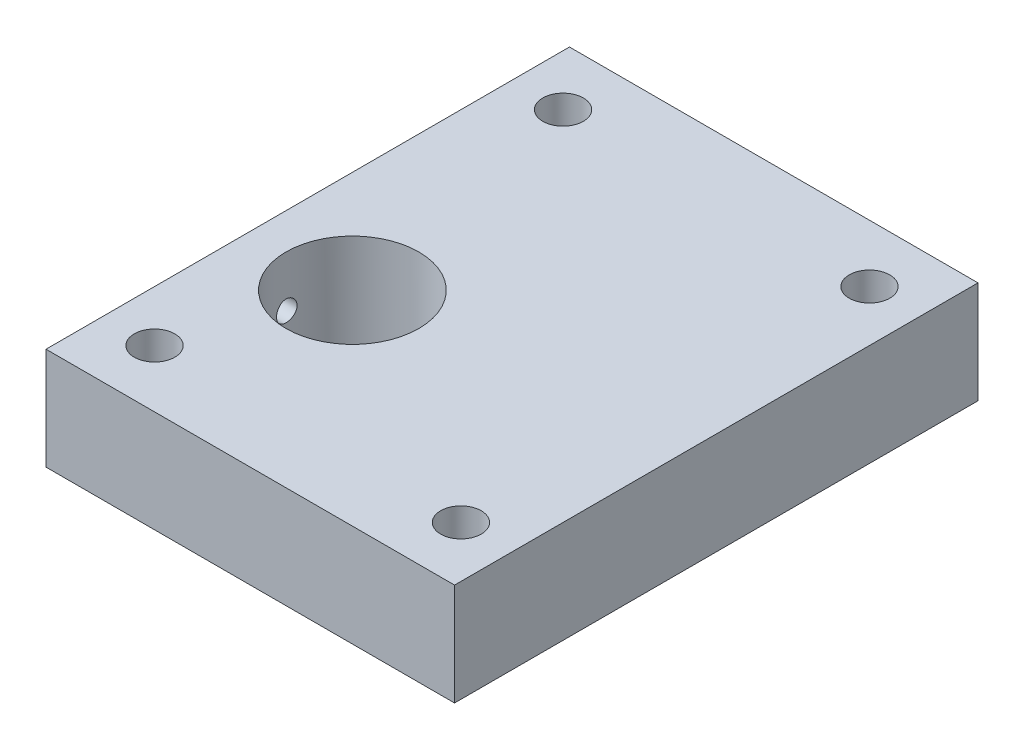
ISO-10303-21;
HEADER;
FILE_DESCRIPTION(('STEP AP214'),'2;1');
FILE_NAME('part.step','',(''),(''),'','','');
FILE_SCHEMA(('AUTOMOTIVE_DESIGN { 1 0 10303 214 1 1 1 1 }'));
ENDSEC;
DATA;
#1=APPLICATION_CONTEXT('core data for automotive mechanical design processes');
#2=APPLICATION_PROTOCOL_DEFINITION('international standard','automotive_design',2000,#1);
#3=PRODUCT_CONTEXT('',#1,'mechanical');
#4=PRODUCT('Part','Part','',(#3));
#5=PRODUCT_RELATED_PRODUCT_CATEGORY('part','',(#4));
#6=PRODUCT_DEFINITION_FORMATION('','',#4);
#7=PRODUCT_DEFINITION_CONTEXT('part definition',#1,'design');
#8=PRODUCT_DEFINITION('design','',#6,#7);
#9=PRODUCT_DEFINITION_SHAPE('','',#8);
#10=(LENGTH_UNIT() NAMED_UNIT(*) SI_UNIT(.MILLI.,.METRE.));
#11=(NAMED_UNIT(*) PLANE_ANGLE_UNIT() SI_UNIT($,.RADIAN.));
#12=(NAMED_UNIT(*) SI_UNIT($,.STERADIAN.) SOLID_ANGLE_UNIT());
#13=UNCERTAINTY_MEASURE_WITH_UNIT(LENGTH_MEASURE(1.E-05),#10,'distance_accuracy_value','');
#14=(GEOMETRIC_REPRESENTATION_CONTEXT(3) GLOBAL_UNCERTAINTY_ASSIGNED_CONTEXT((#13)) GLOBAL_UNIT_ASSIGNED_CONTEXT((#10,
#11,#12)) REPRESENTATION_CONTEXT('',''));
#15=CARTESIAN_POINT('',(0.,0.,0.));
#16=DIRECTION('',(0.,0.,1.));
#17=DIRECTION('',(1.,0.,0.));
#18=AXIS2_PLACEMENT_3D('',#15,#16,#17);
#19=CARTESIAN_POINT('',(50.8,12.7,65.0875));
#20=DIRECTION('',(-1.,0.,0.));
#21=DIRECTION('',(0.,0.,1.));
#22=AXIS2_PLACEMENT_3D('',#19,#20,#21);
#23=PLANE('',#22);
#24=DIRECTION('',(0.,0.,-1.));
#25=VECTOR('',#24,1.);
#26=CARTESIAN_POINT('',(50.8,-12.7,65.0875));
#27=LINE('',#26,#25);
#28=CARTESIAN_POINT('',(50.8,-12.7,65.0875));
#29=VERTEX_POINT('',#28);
#30=CARTESIAN_POINT('',(50.8,-12.7,-65.0875));
#31=VERTEX_POINT('',#30);
#32=EDGE_CURVE('E109',#29,#31,#27,.T.);
#33=ORIENTED_EDGE('',*,*,#32,.T.);
#34=DIRECTION('',(0.,-1.,0.));
#35=VECTOR('',#34,1.);
#36=CARTESIAN_POINT('',(50.8,12.7,-65.0875));
#37=LINE('',#36,#35);
#38=CARTESIAN_POINT('',(50.8,12.7,-65.0875));
#39=VERTEX_POINT('',#38);
#40=EDGE_CURVE('E11',#39,#31,#37,.T.);
#41=ORIENTED_EDGE('',*,*,#40,.F.);
#42=DIRECTION('',(0.,0.,-1.));
#43=VECTOR('',#42,1.);
#44=CARTESIAN_POINT('',(50.8,12.7,65.0875));
#45=LINE('',#44,#43);
#46=CARTESIAN_POINT('',(50.8,12.7,65.0875));
#47=VERTEX_POINT('',#46);
#48=EDGE_CURVE('E96',#47,#39,#45,.T.);
#49=ORIENTED_EDGE('',*,*,#48,.F.);
#50=DIRECTION('',(0.,-1.,0.));
#51=VECTOR('',#50,1.);
#52=CARTESIAN_POINT('',(50.8,12.7,65.0875));
#53=LINE('',#52,#51);
#54=EDGE_CURVE('E105',#47,#29,#53,.T.);
#55=ORIENTED_EDGE('',*,*,#54,.T.);
#56=EDGE_LOOP('',(#33,#41,#49,#55));
#57=FACE_BOUND('',#56,.T.);
#58=ADVANCED_FACE('F39',(#57),#23,.F.);
#59=CARTESIAN_POINT('',(-50.8,12.7,-65.0875));
#60=DIRECTION('',(0.,0.,1.));
#61=DIRECTION('',(1.,0.,0.));
#62=AXIS2_PLACEMENT_3D('',#59,#60,#61);
#63=PLANE('',#62);
#64=DIRECTION('',(-1.,0.,0.));
#65=VECTOR('',#64,1.);
#66=CARTESIAN_POINT('',(-50.8,-12.7,-65.0875));
#67=LINE('',#66,#65);
#68=CARTESIAN_POINT('',(-50.8,-12.7,-65.0875));
#69=VERTEX_POINT('',#68);
#70=EDGE_CURVE('E100',#31,#69,#67,.T.);
#71=ORIENTED_EDGE('',*,*,#70,.T.);
#72=DIRECTION('',(0.,-1.,0.));
#73=VECTOR('',#72,1.);
#74=CARTESIAN_POINT('',(-50.8,12.7,-65.0875));
#75=LINE('',#74,#73);
#76=CARTESIAN_POINT('',(-50.8,12.7,-65.0875));
#77=VERTEX_POINT('',#76);
#78=EDGE_CURVE('E53',#77,#69,#75,.T.);
#79=ORIENTED_EDGE('',*,*,#78,.F.);
#80=DIRECTION('',(-1.,0.,0.));
#81=VECTOR('',#80,1.);
#82=CARTESIAN_POINT('',(-50.8,12.7,-65.0875));
#83=LINE('',#82,#81);
#84=EDGE_CURVE('E91',#39,#77,#83,.T.);
#85=ORIENTED_EDGE('',*,*,#84,.F.);
#86=ORIENTED_EDGE('',*,*,#40,.T.);
#87=EDGE_LOOP('',(#71,#79,#85,#86));
#88=FACE_BOUND('',#87,.T.);
#89=ADVANCED_FACE('F99',(#88),#63,.F.);
#90=CARTESIAN_POINT('',(-50.8,12.7,65.0875));
#91=DIRECTION('',(1.,0.,0.));
#92=DIRECTION('',(0.,0.,-1.));
#93=AXIS2_PLACEMENT_3D('',#90,#91,#92);
#94=PLANE('',#93);
#95=CARTESIAN_POINT('',(-50.8,0.,14.2875));
#96=DIRECTION('',(-1.,0.,0.));
#97=DIRECTION('',(0.,0.,1.));
#98=AXIS2_PLACEMENT_3D('',#95,#96,#97);
#99=CIRCLE('',#98,2.5527);
#100=CARTESIAN_POINT('',(-50.8,0.,16.8402));
#101=VERTEX_POINT('',#100);
#102=EDGE_CURVE('E152',#101,#101,#99,.T.);
#103=ORIENTED_EDGE('',*,*,#102,.F.);
#104=EDGE_LOOP('',(#103));
#105=FACE_BOUND('',#104,.T.);
#106=DIRECTION('',(0.,0.,1.));
#107=VECTOR('',#106,1.);
#108=CARTESIAN_POINT('',(-50.8,-12.7,65.0875));
#109=LINE('',#108,#107);
#110=CARTESIAN_POINT('',(-50.8,-12.7,65.0875));
#111=VERTEX_POINT('',#110);
#112=EDGE_CURVE('E78',#69,#111,#109,.T.);
#113=ORIENTED_EDGE('',*,*,#112,.T.);
#114=DIRECTION('',(0.,-1.,0.));
#115=VECTOR('',#114,1.);
#116=CARTESIAN_POINT('',(-50.8,12.7,65.0875));
#117=LINE('',#116,#115);
#118=CARTESIAN_POINT('',(-50.8,12.7,65.0875));
#119=VERTEX_POINT('',#118);
#120=EDGE_CURVE('E101',#119,#111,#117,.T.);
#121=ORIENTED_EDGE('',*,*,#120,.F.);
#122=DIRECTION('',(0.,0.,1.));
#123=VECTOR('',#122,1.);
#124=CARTESIAN_POINT('',(-50.8,12.7,65.0875));
#125=LINE('',#124,#123);
#126=EDGE_CURVE('E94',#77,#119,#125,.T.);
#127=ORIENTED_EDGE('',*,*,#126,.F.);
#128=ORIENTED_EDGE('',*,*,#78,.T.);
#129=EDGE_LOOP('',(#113,#121,#127,#128));
#130=FACE_BOUND('',#129,.T.);
#131=ADVANCED_FACE('F103',(#105,#130),#94,.F.);
#132=CARTESIAN_POINT('',(-50.8,12.7,65.0875));
#133=DIRECTION('',(0.,0.,-1.));
#134=DIRECTION('',(-1.,0.,0.));
#135=AXIS2_PLACEMENT_3D('',#132,#133,#134);
#136=PLANE('',#135);
#137=DIRECTION('',(1.,0.,0.));
#138=VECTOR('',#137,1.);
#139=CARTESIAN_POINT('',(-50.8,-12.7,65.0875));
#140=LINE('',#139,#138);
#141=EDGE_CURVE('E84',#111,#29,#140,.T.);
#142=ORIENTED_EDGE('',*,*,#141,.T.);
#143=ORIENTED_EDGE('',*,*,#54,.F.);
#144=DIRECTION('',(1.,0.,0.));
#145=VECTOR('',#144,1.);
#146=CARTESIAN_POINT('',(-50.8,12.7,65.0875));
#147=LINE('',#146,#145);
#148=EDGE_CURVE('E61',#119,#47,#147,.T.);
#149=ORIENTED_EDGE('',*,*,#148,.F.);
#150=ORIENTED_EDGE('',*,*,#120,.T.);
#151=EDGE_LOOP('',(#142,#143,#149,#150));
#152=FACE_BOUND('',#151,.T.);
#153=ADVANCED_FACE('F117',(#152),#136,.F.);
#154=CARTESIAN_POINT('',(0.,12.7,0.));
#155=DIRECTION('',(0.,-1.,0.));
#156=DIRECTION('',(0.,0.,-1.));
#157=AXIS2_PLACEMENT_3D('',#154,#155,#156);
#158=PLANE('',#157);
#159=CARTESIAN_POINT('',(38.1,12.7,-50.8000000000001));
#160=DIRECTION('',(0.,-1.,0.));
#161=DIRECTION('',(0.,0.,-1.));
#162=AXIS2_PLACEMENT_3D('',#159,#160,#161);
#163=CIRCLE('',#162,5.04189999999999);
#164=CARTESIAN_POINT('',(38.1,12.7,-55.8419000000001));
#165=VERTEX_POINT('',#164);
#166=EDGE_CURVE('E146',#165,#165,#163,.T.);
#167=ORIENTED_EDGE('',*,*,#166,.T.);
#168=EDGE_LOOP('',(#167));
#169=FACE_BOUND('',#168,.T.);
#170=CARTESIAN_POINT('',(-38.1000000000001,12.7,-50.8000000000001));
#171=DIRECTION('',(0.,-1.,0.));
#172=DIRECTION('',(0.,0.,-1.));
#173=AXIS2_PLACEMENT_3D('',#170,#171,#172);
#174=CIRCLE('',#173,5.04189999999999);
#175=CARTESIAN_POINT('',(-38.1000000000001,12.7,-55.8419000000001));
#176=VERTEX_POINT('',#175);
#177=EDGE_CURVE('E140',#176,#176,#174,.T.);
#178=ORIENTED_EDGE('',*,*,#177,.T.);
#179=EDGE_LOOP('',(#178));
#180=FACE_BOUND('',#179,.T.);
#181=CARTESIAN_POINT('',(-38.1,12.7,50.7999999999999));
#182=DIRECTION('',(0.,-1.,0.));
#183=DIRECTION('',(0.,0.,-1.));
#184=AXIS2_PLACEMENT_3D('',#181,#182,#183);
#185=CIRCLE('',#184,5.04189999999999);
#186=CARTESIAN_POINT('',(-38.1,12.7,45.7580999999999));
#187=VERTEX_POINT('',#186);
#188=EDGE_CURVE('E134',#187,#187,#185,.T.);
#189=ORIENTED_EDGE('',*,*,#188,.T.);
#190=EDGE_LOOP('',(#189));
#191=FACE_BOUND('',#190,.T.);
#192=CARTESIAN_POINT('',(38.0999999999999,12.7,50.7999999999999));
#193=DIRECTION('',(0.,-1.,0.));
#194=DIRECTION('',(0.,0.,-1.));
#195=AXIS2_PLACEMENT_3D('',#192,#193,#194);
#196=CIRCLE('',#195,5.04189999999999);
#197=CARTESIAN_POINT('',(38.0999999999999,12.7,45.7580999999999));
#198=VERTEX_POINT('',#197);
#199=EDGE_CURVE('E128',#198,#198,#196,.T.);
#200=ORIENTED_EDGE('',*,*,#199,.T.);
#201=EDGE_LOOP('',(#200));
#202=FACE_BOUND('',#201,.T.);
#203=CARTESIAN_POINT('',(-25.4,12.7,14.2875));
#204=DIRECTION('',(0.,-1.,0.));
#205=DIRECTION('',(0.,0.,-1.));
#206=AXIS2_PLACEMENT_3D('',#203,#204,#205);
#207=CIRCLE('',#206,16.51);
#208=CARTESIAN_POINT('',(-25.4,12.7,-2.22250000000001));
#209=VERTEX_POINT('',#208);
#210=EDGE_CURVE('E112',#209,#209,#207,.T.);
#211=ORIENTED_EDGE('',*,*,#210,.T.);
#212=EDGE_LOOP('',(#211));
#213=FACE_BOUND('',#212,.T.);
#214=ORIENTED_EDGE('',*,*,#48,.T.);
#215=ORIENTED_EDGE('',*,*,#84,.T.);
#216=ORIENTED_EDGE('',*,*,#126,.T.);
#217=ORIENTED_EDGE('',*,*,#148,.T.);
#218=EDGE_LOOP('',(#214,#215,#216,#217));
#219=FACE_BOUND('',#218,.T.);
#220=ADVANCED_FACE('F92',(#169,#180,#191,#202,#213,#219),#158,.F.);
#221=CARTESIAN_POINT('',(0.,-12.7,0.));
#222=DIRECTION('',(0.,-1.,0.));
#223=DIRECTION('',(0.,0.,-1.));
#224=AXIS2_PLACEMENT_3D('',#221,#222,#223);
#225=PLANE('',#224);
#226=CARTESIAN_POINT('',(38.1,-12.7,-50.8000000000001));
#227=DIRECTION('',(0.,-1.,0.));
#228=DIRECTION('',(0.,0.,-1.));
#229=AXIS2_PLACEMENT_3D('',#226,#227,#228);
#230=CIRCLE('',#229,5.04189999999999);
#231=CARTESIAN_POINT('',(38.1,-12.7,-55.8419000000001));
#232=VERTEX_POINT('',#231);
#233=EDGE_CURVE('E149',#232,#232,#230,.T.);
#234=ORIENTED_EDGE('',*,*,#233,.F.);
#235=EDGE_LOOP('',(#234));
#236=FACE_BOUND('',#235,.T.);
#237=CARTESIAN_POINT('',(-38.1000000000001,-12.7,-50.8000000000001));
#238=DIRECTION('',(0.,-1.,0.));
#239=DIRECTION('',(0.,0.,-1.));
#240=AXIS2_PLACEMENT_3D('',#237,#238,#239);
#241=CIRCLE('',#240,5.04189999999999);
#242=CARTESIAN_POINT('',(-38.1000000000001,-12.7,-55.8419000000001));
#243=VERTEX_POINT('',#242);
#244=EDGE_CURVE('E143',#243,#243,#241,.T.);
#245=ORIENTED_EDGE('',*,*,#244,.F.);
#246=EDGE_LOOP('',(#245));
#247=FACE_BOUND('',#246,.T.);
#248=CARTESIAN_POINT('',(-38.1,-12.7,50.7999999999999));
#249=DIRECTION('',(0.,-1.,0.));
#250=DIRECTION('',(0.,0.,-1.));
#251=AXIS2_PLACEMENT_3D('',#248,#249,#250);
#252=CIRCLE('',#251,5.04189999999999);
#253=CARTESIAN_POINT('',(-38.1,-12.7,45.7580999999999));
#254=VERTEX_POINT('',#253);
#255=EDGE_CURVE('E137',#254,#254,#252,.T.);
#256=ORIENTED_EDGE('',*,*,#255,.F.);
#257=EDGE_LOOP('',(#256));
#258=FACE_BOUND('',#257,.T.);
#259=CARTESIAN_POINT('',(38.0999999999999,-12.7,50.7999999999999));
#260=DIRECTION('',(0.,-1.,0.));
#261=DIRECTION('',(0.,0.,-1.));
#262=AXIS2_PLACEMENT_3D('',#259,#260,#261);
#263=CIRCLE('',#262,5.04189999999999);
#264=CARTESIAN_POINT('',(38.0999999999999,-12.7,45.7580999999999));
#265=VERTEX_POINT('',#264);
#266=EDGE_CURVE('E131',#265,#265,#263,.T.);
#267=ORIENTED_EDGE('',*,*,#266,.F.);
#268=EDGE_LOOP('',(#267));
#269=FACE_BOUND('',#268,.T.);
#270=CARTESIAN_POINT('',(-25.4,-12.7,14.2875));
#271=DIRECTION('',(0.,1.,0.));
#272=DIRECTION('',(0.,0.,1.));
#273=AXIS2_PLACEMENT_3D('',#270,#271,#272);
#274=CIRCLE('',#273,16.51);
#275=CARTESIAN_POINT('',(-25.4,-12.7,30.7975));
#276=VERTEX_POINT('',#275);
#277=EDGE_CURVE('E125',#276,#276,#274,.T.);
#278=ORIENTED_EDGE('',*,*,#277,.T.);
#279=EDGE_LOOP('',(#278));
#280=FACE_BOUND('',#279,.T.);
#281=ORIENTED_EDGE('',*,*,#32,.F.);
#282=ORIENTED_EDGE('',*,*,#141,.F.);
#283=ORIENTED_EDGE('',*,*,#112,.F.);
#284=ORIENTED_EDGE('',*,*,#70,.F.);
#285=EDGE_LOOP('',(#281,#282,#283,#284));
#286=FACE_BOUND('',#285,.T.);
#287=ADVANCED_FACE('F120',(#236,#247,#258,#269,#280,#286),#225,.T.);
#288=CARTESIAN_POINT('',(-25.4,-12.7,14.2875));
#289=DIRECTION('',(0.,1.,0.));
#290=DIRECTION('',(0.,0.,1.));
#291=AXIS2_PLACEMENT_3D('',#288,#289,#290);
#292=CYLINDRICAL_SURFACE('',#291,16.51);
#293=CARTESIAN_POINT('',(-41.711462923662,0.,16.8402));
#294=CARTESIAN_POINT('',(-41.7114653608355,0.142463785669464,16.8401941558135));
#295=CARTESIAN_POINT('',(-41.7133495386722,0.285008965243151,16.8282335000816));
#296=CARTESIAN_POINT('',(-41.7206770972718,0.566110142367231,16.780721752144));
#297=CARTESIAN_POINT('',(-41.7261238990706,0.704662171814229,16.7451479847867));
#298=CARTESIAN_POINT('',(-41.73994537688,0.973667682707717,16.6515029856885));
#299=CARTESIAN_POINT('',(-41.748317752167,1.10412743341317,16.5934494285889));
#300=CARTESIAN_POINT('',(-41.7670442940817,1.35343700474115,16.4565350620397));
#301=CARTESIAN_POINT('',(-41.7773982011669,1.47228834276597,16.3776769770703));
#302=CARTESIAN_POINT('',(-41.7990195539416,1.69603472324344,16.20067652412));
#303=CARTESIAN_POINT('',(-41.8102933462784,1.80081679556406,16.1023921074839));
#304=CARTESIAN_POINT('',(-41.832427624094,1.99247068197318,15.8896357345025));
#305=CARTESIAN_POINT('',(-41.843288086357,2.07934149123842,15.775162870591));
#306=CARTESIAN_POINT('',(-41.8634386392687,2.23312570482947,15.5325530596315));
#307=CARTESIAN_POINT('',(-41.8727204148748,2.29993477346072,15.4043492273155));
#308=CARTESIAN_POINT('',(-41.888597404654,2.41102919939641,15.1383721977809));
#309=CARTESIAN_POINT('',(-41.8951927694684,2.45531581968751,15.0005995376438));
#310=CARTESIAN_POINT('',(-41.9049090363853,2.51976491118648,14.7205602256272));
#311=CARTESIAN_POINT('',(-41.9080571970035,2.54011674137104,14.5783381144924));
#312=CARTESIAN_POINT('',(-41.9106178284497,2.5567067395711,14.2924651383502));
#313=CARTESIAN_POINT('',(-41.9100305192962,2.55294632779301,14.1488143579887));
#314=CARTESIAN_POINT('',(-41.905208110821,2.52156755131753,13.8654544227529));
#315=CARTESIAN_POINT('',(-41.901004163192,2.4941529248128,13.7257221007008));
#316=CARTESIAN_POINT('',(-41.8894555409433,2.41656399303134,13.4528651691592));
#317=CARTESIAN_POINT('',(-41.8821107814247,2.36638907252086,13.3197407383955));
#318=CARTESIAN_POINT('',(-41.8650523786596,2.24449689218196,13.0632647108869));
#319=CARTESIAN_POINT('',(-41.8553293864669,2.1726943488215,12.9399542929081));
#320=CARTESIAN_POINT('',(-41.8345972448819,2.00964745526113,12.7070555783104));
#321=CARTESIAN_POINT('',(-41.8235880056502,1.91840174666217,12.597468241306));
#322=CARTESIAN_POINT('',(-41.8013744829633,1.71792498782441,12.3939247475464));
#323=CARTESIAN_POINT('',(-41.7901693634262,1.60851600385891,12.3001438494055));
#324=CARTESIAN_POINT('',(-41.7689389044353,1.37542160438004,12.1322451973262));
#325=CARTESIAN_POINT('',(-41.7589135731349,1.25173609021499,12.0581275792739));
#326=CARTESIAN_POINT('',(-41.7411778387106,0.993411449741376,11.9316328745645));
#327=CARTESIAN_POINT('',(-41.7334694428757,0.858762953190854,11.8792746243098));
#328=CARTESIAN_POINT('',(-41.7212752222028,0.582437332492409,11.7979655921682));
#329=CARTESIAN_POINT('',(-41.7167891552942,0.440760737170417,11.7690130519567));
#330=CARTESIAN_POINT('',(-41.7115936872315,0.15596224455037,11.7355793684495));
#331=CARTESIAN_POINT('',(-41.7108458889067,0.0128702328814908,11.7308494134547));
#332=CARTESIAN_POINT('',(-41.7131095961708,-0.272062444702764,11.7453341986562));
#333=CARTESIAN_POINT('',(-41.7161209775507,-0.413903151807146,11.7645481477106));
#334=CARTESIAN_POINT('',(-41.7255284108345,-0.691530853130017,11.8261640018116));
#335=CARTESIAN_POINT('',(-41.7319062583059,-0.82734618848502,11.8684412311542));
#336=CARTESIAN_POINT('',(-41.7473129182297,-1.08996315654666,11.9748535756055));
#337=CARTESIAN_POINT('',(-41.7563418690805,-1.2167643182473,12.0389898318726));
#338=CARTESIAN_POINT('',(-41.7761235305219,-1.45886673932602,12.187894612659));
#339=CARTESIAN_POINT('',(-41.7868894274402,-1.57406810600153,12.2728237691144));
#340=CARTESIAN_POINT('',(-41.8088925305119,-1.78867235164167,12.4606809784083));
#341=CARTESIAN_POINT('',(-41.8201297650071,-1.8880742788509,12.5636101147786));
#342=CARTESIAN_POINT('',(-41.8419297835565,-2.06915555432004,12.7856430305166));
#343=CARTESIAN_POINT('',(-41.852485694345,-2.15066973149198,12.9048822921325));
#344=CARTESIAN_POINT('',(-41.8716259864272,-2.29250921159944,13.1555063979862));
#345=CARTESIAN_POINT('',(-41.8802104243666,-2.35283512335663,13.2868908931069));
#346=CARTESIAN_POINT('',(-41.8944104869477,-2.45032355896637,13.5575669499631));
#347=CARTESIAN_POINT('',(-41.9000375404474,-2.4875753543257,13.6968257340852));
#348=CARTESIAN_POINT('',(-41.9077368856027,-2.5381466553277,13.9797158961855));
#349=CARTESIAN_POINT('',(-41.9098094273618,-2.55146784478492,14.1233469657961));
#350=CARTESIAN_POINT('',(-41.9101634492481,-2.55375673197532,14.4093046593555));
#351=CARTESIAN_POINT('',(-41.9084842112092,-2.54297677242567,14.5516292788808));
#352=CARTESIAN_POINT('',(-41.9016028235493,-2.49791156213727,14.8324158116259));
#353=CARTESIAN_POINT('',(-41.8964006873166,-2.46362640072699,14.9708777395234));
#354=CARTESIAN_POINT('',(-41.8830554451645,-2.37261552654433,15.2399319044357));
#355=CARTESIAN_POINT('',(-41.8749147700218,-2.31590835770069,15.3705305421294));
#356=CARTESIAN_POINT('',(-41.8565851243428,-2.18169038426174,15.6203988269719));
#357=CARTESIAN_POINT('',(-41.8463960790081,-2.10417881993852,15.7396680601819));
#358=CARTESIAN_POINT('',(-41.8249747748667,-1.92964458992292,15.9647695631799));
#359=CARTESIAN_POINT('',(-41.8137331698607,-1.83243599770488,16.0704567978879));
#360=CARTESIAN_POINT('',(-41.7915416774408,-1.62165823294591,16.2641099598654));
#361=CARTESIAN_POINT('',(-41.7805918590473,-1.50808522949999,16.3520717260094));
#362=CARTESIAN_POINT('',(-41.760153150928,-1.26699915036304,16.5082540081948));
#363=CARTESIAN_POINT('',(-41.750673417604,-1.13940654943613,16.5763529540441));
#364=CARTESIAN_POINT('',(-41.7343557609389,-0.874505487489065,16.6900506241928));
#365=CARTESIAN_POINT('',(-41.7275151247741,-0.737207176080796,16.7356724669644));
#366=CARTESIAN_POINT('',(-41.7188138141854,-0.499427874653173,16.7928853650288));
#367=CARTESIAN_POINT('',(-41.7160720336458,-0.400408143887981,16.8106008575319));
#368=CARTESIAN_POINT('',(-41.7123957417038,-0.200939094279659,16.8342601523142));
#369=CARTESIAN_POINT('',(-41.711461204551,-0.100489795826101,16.8402041223186));
#370=CARTESIAN_POINT('',(-41.711462923662,0.,16.8402));
#371=B_SPLINE_CURVE_WITH_KNOTS('',3,(#293,#294,#295,#296,#297,#298,#299,#300,#301,#302,#303,
#304,#305,#306,#307,#308,#309,#310,#311,#312,#313,#314,#315,#316,#317,#318,#319,#320,#321,#322,
#323,#324,#325,#326,#327,#328,#329,#330,#331,#332,#333,#334,#335,#336,#337,#338,#339,#340,#341,
#342,#343,#344,#345,#346,#347,#348,#349,#350,#351,#352,#353,#354,#355,#356,#357,#358,#359,#360,
#361,#362,#363,#364,#365,#366,#367,#368,#369,#370),.UNSPECIFIED.,.T.,.F.,(4,2,2,2,2,2,2,2,2,2,2,
2,2,2,2,2,2,2,2,2,2,2,2,2,2,2,2,2,2,2,2,2,2,2,2,2,2,2,4),(0.,0.427024010781424,
0.854458677705956,1.28155795604603,1.7086013308595,2.13889124941373,2.56920530070223,
3.00172001094862,3.43421046448254,3.86325576724568,4.29227579955502,4.71763707572319,
5.1430098505216,5.57008244587452,5.9971848884936,6.42874925444045,6.86031660270119,
7.29225677097521,7.724164487271,8.15162666767369,8.57907472446871,9.00423465168025,
9.42941677792183,9.8579933896504,10.2865958089809,10.719003256848,11.1513982789425,
11.5821097832676,12.0127909805159,12.4389840199509,12.8651754397036,13.2910151163009,
13.7168703456843,14.146950154526,14.5771308090277,15.0098916387121,15.442206424938,
15.7434209889632,16.044631261136),.UNSPECIFIED.);
#372=CARTESIAN_POINT('',(-41.711462923662,0.,16.8402));
#373=VERTEX_POINT('',#372);
#374=EDGE_CURVE('E42',#373,#373,#371,.T.);
#375=ORIENTED_EDGE('',*,*,#374,.T.);
#376=EDGE_LOOP('',(#375));
#377=FACE_BOUND('',#376,.T.);
#378=ORIENTED_EDGE('',*,*,#277,.F.);
#379=EDGE_LOOP('',(#378));
#380=FACE_BOUND('',#379,.T.);
#381=ORIENTED_EDGE('',*,*,#210,.F.);
#382=EDGE_LOOP('',(#381));
#383=FACE_BOUND('',#382,.T.);
#384=ADVANCED_FACE('F159',(#377,#380,#383),#292,.F.);
#385=CARTESIAN_POINT('',(38.0999999999999,-12.7,50.7999999999999));
#386=DIRECTION('',(0.,-1.,0.));
#387=DIRECTION('',(0.,0.,-1.));
#388=AXIS2_PLACEMENT_3D('',#385,#386,#387);
#389=CYLINDRICAL_SURFACE('',#388,5.04189999999999);
#390=ORIENTED_EDGE('',*,*,#199,.F.);
#391=EDGE_LOOP('',(#390));
#392=FACE_BOUND('',#391,.T.);
#393=ORIENTED_EDGE('',*,*,#266,.T.);
#394=EDGE_LOOP('',(#393));
#395=FACE_BOUND('',#394,.T.);
#396=ADVANCED_FACE('F192',(#392,#395),#389,.F.);
#397=CARTESIAN_POINT('',(-38.1,-12.7,50.7999999999999));
#398=DIRECTION('',(0.,-1.,0.));
#399=DIRECTION('',(0.,0.,-1.));
#400=AXIS2_PLACEMENT_3D('',#397,#398,#399);
#401=CYLINDRICAL_SURFACE('',#400,5.04189999999999);
#402=ORIENTED_EDGE('',*,*,#188,.F.);
#403=EDGE_LOOP('',(#402));
#404=FACE_BOUND('',#403,.T.);
#405=ORIENTED_EDGE('',*,*,#255,.T.);
#406=EDGE_LOOP('',(#405));
#407=FACE_BOUND('',#406,.T.);
#408=ADVANCED_FACE('F195',(#404,#407),#401,.F.);
#409=CARTESIAN_POINT('',(-38.1000000000001,-12.7,-50.8000000000001));
#410=DIRECTION('',(0.,-1.,0.));
#411=DIRECTION('',(0.,0.,-1.));
#412=AXIS2_PLACEMENT_3D('',#409,#410,#411);
#413=CYLINDRICAL_SURFACE('',#412,5.04189999999999);
#414=ORIENTED_EDGE('',*,*,#177,.F.);
#415=EDGE_LOOP('',(#414));
#416=FACE_BOUND('',#415,.T.);
#417=ORIENTED_EDGE('',*,*,#244,.T.);
#418=EDGE_LOOP('',(#417));
#419=FACE_BOUND('',#418,.T.);
#420=ADVANCED_FACE('F168',(#416,#419),#413,.F.);
#421=CARTESIAN_POINT('',(38.1,-12.7,-50.8000000000001));
#422=DIRECTION('',(0.,-1.,0.));
#423=DIRECTION('',(0.,0.,-1.));
#424=AXIS2_PLACEMENT_3D('',#421,#422,#423);
#425=CYLINDRICAL_SURFACE('',#424,5.04189999999999);
#426=ORIENTED_EDGE('',*,*,#166,.F.);
#427=EDGE_LOOP('',(#426));
#428=FACE_BOUND('',#427,.T.);
#429=ORIENTED_EDGE('',*,*,#233,.T.);
#430=EDGE_LOOP('',(#429));
#431=FACE_BOUND('',#430,.T.);
#432=ADVANCED_FACE('F164',(#428,#431),#425,.F.);
#433=CARTESIAN_POINT('',(-50.8,0.,14.2875));
#434=DIRECTION('',(-1.,0.,0.));
#435=DIRECTION('',(0.,0.,1.));
#436=AXIS2_PLACEMENT_3D('',#433,#434,#435);
#437=CYLINDRICAL_SURFACE('',#436,2.5527);
#438=ORIENTED_EDGE('',*,*,#102,.T.);
#439=EDGE_LOOP('',(#438));
#440=FACE_BOUND('',#439,.T.);
#441=ORIENTED_EDGE('',*,*,#374,.F.);
#442=EDGE_LOOP('',(#441));
#443=FACE_BOUND('',#442,.T.);
#444=ADVANCED_FACE('F162',(#440,#443),#437,.F.);
#445=CLOSED_SHELL('',(#58,#89,#131,#153,#220,#287,#384,#396,#408,#420,#432,#444));
#446=MANIFOLD_SOLID_BREP('B2',#445);
#447=ADVANCED_BREP_SHAPE_REPRESENTATION('',(#18,#446),#14);
#448=SHAPE_DEFINITION_REPRESENTATION(#9,#447);
ENDSEC;
END-ISO-10303-21;
